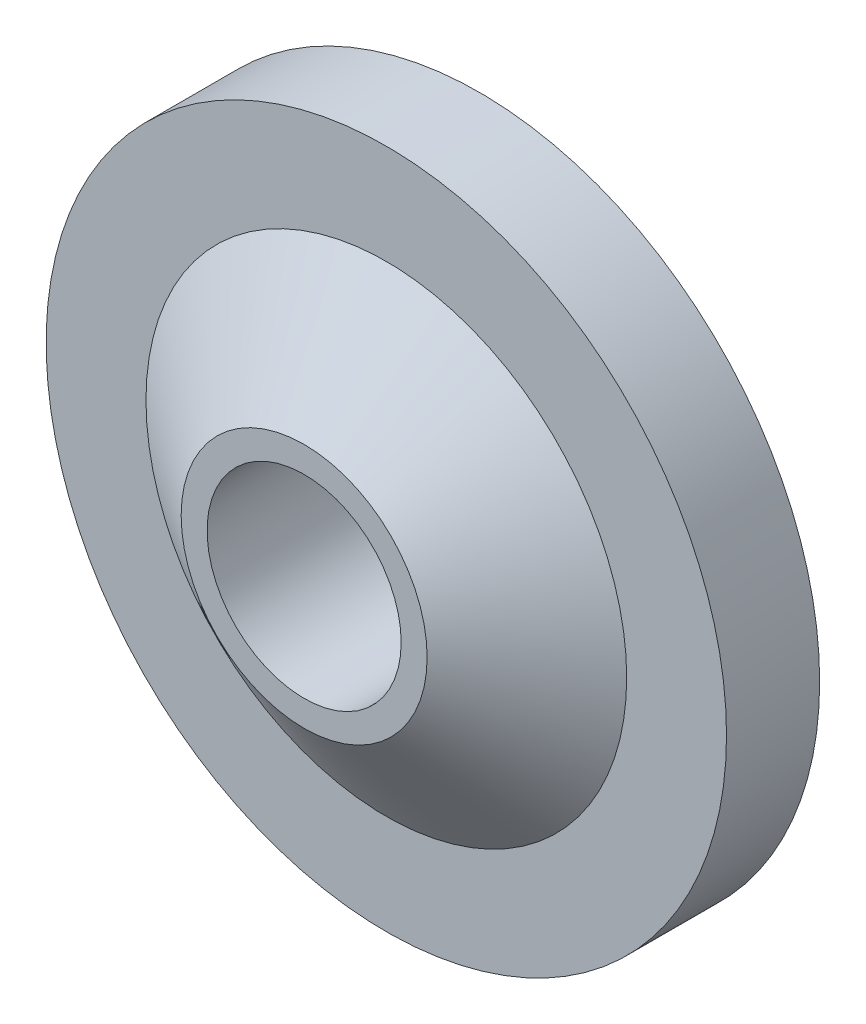
ISO-10303-21;
HEADER;
FILE_DESCRIPTION(('STEP AP214'),'2;1');
FILE_NAME('part.step','',(''),(''),'','','');
FILE_SCHEMA(('AUTOMOTIVE_DESIGN { 1 0 10303 214 1 1 1 1 }'));
ENDSEC;
DATA;
#1=APPLICATION_CONTEXT('core data for automotive mechanical design processes');
#2=APPLICATION_PROTOCOL_DEFINITION('international standard','automotive_design',2000,#1);
#3=PRODUCT_CONTEXT('',#1,'mechanical');
#4=PRODUCT('Part','Part','',(#3));
#5=PRODUCT_RELATED_PRODUCT_CATEGORY('part','',(#4));
#6=PRODUCT_DEFINITION_FORMATION('','',#4);
#7=PRODUCT_DEFINITION_CONTEXT('part definition',#1,'design');
#8=PRODUCT_DEFINITION('design','',#6,#7);
#9=PRODUCT_DEFINITION_SHAPE('','',#8);
#10=(LENGTH_UNIT() NAMED_UNIT(*) SI_UNIT(.MILLI.,.METRE.));
#11=(NAMED_UNIT(*) PLANE_ANGLE_UNIT() SI_UNIT($,.RADIAN.));
#12=(NAMED_UNIT(*) SI_UNIT($,.STERADIAN.) SOLID_ANGLE_UNIT());
#13=UNCERTAINTY_MEASURE_WITH_UNIT(LENGTH_MEASURE(1.E-05),#10,'distance_accuracy_value','');
#14=(GEOMETRIC_REPRESENTATION_CONTEXT(3) GLOBAL_UNCERTAINTY_ASSIGNED_CONTEXT((#13)) GLOBAL_UNIT_ASSIGNED_CONTEXT((#10,
#11,#12)) REPRESENTATION_CONTEXT('',''));
#15=CARTESIAN_POINT('',(0.,0.,0.));
#16=DIRECTION('',(0.,0.,1.));
#17=DIRECTION('',(1.,0.,0.));
#18=AXIS2_PLACEMENT_3D('',#15,#16,#17);
#19=CARTESIAN_POINT('',(0.,0.,17.));
#20=DIRECTION('',(0.,0.,1.));
#21=DIRECTION('',(1.,0.,0.));
#22=AXIS2_PLACEMENT_3D('',#19,#20,#21);
#23=PLANE('',#22);
#24=CARTESIAN_POINT('',(0.,0.,17.));
#25=DIRECTION('',(0.,0.,1.));
#26=DIRECTION('',(1.,0.,0.));
#27=AXIS2_PLACEMENT_3D('',#24,#25,#26);
#28=CIRCLE('',#27,62.09);
#29=CARTESIAN_POINT('',(62.09,0.,17.));
#30=VERTEX_POINT('',#29);
#31=EDGE_CURVE('E43',#30,#30,#28,.T.);
#32=ORIENTED_EDGE('',*,*,#31,.T.);
#33=EDGE_LOOP('',(#32));
#34=FACE_BOUND('',#33,.T.);
#35=CARTESIAN_POINT('',(0.,0.,17.));
#36=DIRECTION('',(0.,0.,1.));
#37=DIRECTION('',(1.,0.,0.));
#38=AXIS2_PLACEMENT_3D('',#35,#36,#37);
#39=CIRCLE('',#38,43.87);
#40=CARTESIAN_POINT('',(43.87,0.,17.));
#41=VERTEX_POINT('',#40);
#42=EDGE_CURVE('E52',#41,#41,#39,.T.);
#43=ORIENTED_EDGE('',*,*,#42,.F.);
#44=EDGE_LOOP('',(#43));
#45=FACE_BOUND('',#44,.T.);
#46=ADVANCED_FACE('F32',(#34,#45),#23,.T.);
#47=CARTESIAN_POINT('',(0.,0.,0.));
#48=DIRECTION('',(0.,0.,1.));
#49=DIRECTION('',(1.,0.,0.));
#50=AXIS2_PLACEMENT_3D('',#47,#48,#49);
#51=CONICAL_SURFACE('',#50,62.09,1.22173047639603);
#52=CARTESIAN_POINT('',(0.,0.,-10.));
#53=DIRECTION('',(0.,0.,1.));
#54=DIRECTION('',(1.,0.,0.));
#55=AXIS2_PLACEMENT_3D('',#52,#53,#54);
#56=CIRCLE('',#55,34.6152258054535);
#57=CARTESIAN_POINT('',(34.6152258054535,0.,-10.));
#58=VERTEX_POINT('',#57);
#59=EDGE_CURVE('E10',#58,#58,#56,.T.);
#60=ORIENTED_EDGE('',*,*,#59,.T.);
#61=EDGE_LOOP('',(#60));
#62=FACE_BOUND('',#61,.T.);
#63=CARTESIAN_POINT('',(0.,0.,0.));
#64=DIRECTION('',(0.,0.,1.));
#65=DIRECTION('',(1.,0.,0.));
#66=AXIS2_PLACEMENT_3D('',#63,#64,#65);
#67=CIRCLE('',#66,62.09);
#68=CARTESIAN_POINT('',(62.09,0.,0.));
#69=VERTEX_POINT('',#68);
#70=EDGE_CURVE('E39',#69,#69,#67,.T.);
#71=ORIENTED_EDGE('',*,*,#70,.F.);
#72=EDGE_LOOP('',(#71));
#73=FACE_BOUND('',#72,.T.);
#74=ADVANCED_FACE('F34',(#62,#73),#51,.T.);
#75=CARTESIAN_POINT('',(0.,0.,-10.));
#76=DIRECTION('',(0.,0.,1.));
#77=DIRECTION('',(1.,0.,0.));
#78=AXIS2_PLACEMENT_3D('',#75,#76,#77);
#79=PLANE('',#78);
#80=CARTESIAN_POINT('',(0.,0.,-10.));
#81=DIRECTION('',(0.,0.,1.));
#82=DIRECTION('',(1.,0.,0.));
#83=AXIS2_PLACEMENT_3D('',#80,#81,#82);
#84=CIRCLE('',#83,17.71);
#85=CARTESIAN_POINT('',(17.71,0.,-10.));
#86=VERTEX_POINT('',#85);
#87=EDGE_CURVE('E55',#86,#86,#84,.T.);
#88=ORIENTED_EDGE('',*,*,#87,.T.);
#89=EDGE_LOOP('',(#88));
#90=FACE_BOUND('',#89,.T.);
#91=ORIENTED_EDGE('',*,*,#59,.F.);
#92=EDGE_LOOP('',(#91));
#93=FACE_BOUND('',#92,.T.);
#94=ADVANCED_FACE('F62',(#90,#93),#79,.F.);
#95=CARTESIAN_POINT('',(0.,0.,17.));
#96=DIRECTION('',(0.,0.,-1.));
#97=DIRECTION('',(-1.,0.,0.));
#98=AXIS2_PLACEMENT_3D('',#95,#96,#97);
#99=CYLINDRICAL_SURFACE('',#98,62.09);
#100=ORIENTED_EDGE('',*,*,#31,.F.);
#101=EDGE_LOOP('',(#100));
#102=FACE_BOUND('',#101,.T.);
#103=ORIENTED_EDGE('',*,*,#70,.T.);
#104=EDGE_LOOP('',(#103));
#105=FACE_BOUND('',#104,.T.);
#106=ADVANCED_FACE('F80',(#102,#105),#99,.T.);
#107=CARTESIAN_POINT('',(0.,0.,17.));
#108=DIRECTION('',(0.,0.,-1.));
#109=DIRECTION('',(1.,0.,0.));
#110=AXIS2_PLACEMENT_3D('',#107,#108,#109);
#111=CONICAL_SURFACE('',#110,43.87,0.959931088596883);
#112=CARTESIAN_POINT('',(0.,0.,32.));
#113=DIRECTION('',(0.,0.,1.));
#114=DIRECTION('',(1.,0.,0.));
#115=AXIS2_PLACEMENT_3D('',#112,#113,#114);
#116=CIRCLE('',#115,22.4477798988682);
#117=CARTESIAN_POINT('',(22.4477798988682,0.,32.));
#118=VERTEX_POINT('',#117);
#119=EDGE_CURVE('E47',#118,#118,#116,.T.);
#120=ORIENTED_EDGE('',*,*,#119,.F.);
#121=EDGE_LOOP('',(#120));
#122=FACE_BOUND('',#121,.T.);
#123=ORIENTED_EDGE('',*,*,#42,.T.);
#124=EDGE_LOOP('',(#123));
#125=FACE_BOUND('',#124,.T.);
#126=ADVANCED_FACE('F74',(#122,#125),#111,.T.);
#127=CARTESIAN_POINT('',(0.,0.,32.));
#128=DIRECTION('',(0.,0.,1.));
#129=DIRECTION('',(1.,0.,0.));
#130=AXIS2_PLACEMENT_3D('',#127,#128,#129);
#131=PLANE('',#130);
#132=CARTESIAN_POINT('',(0.,0.,32.));
#133=DIRECTION('',(0.,0.,1.));
#134=DIRECTION('',(1.,0.,0.));
#135=AXIS2_PLACEMENT_3D('',#132,#133,#134);
#136=CIRCLE('',#135,17.71);
#137=CARTESIAN_POINT('',(17.71,0.,32.));
#138=VERTEX_POINT('',#137);
#139=EDGE_CURVE('E56',#138,#138,#136,.T.);
#140=ORIENTED_EDGE('',*,*,#139,.F.);
#141=EDGE_LOOP('',(#140));
#142=FACE_BOUND('',#141,.T.);
#143=ORIENTED_EDGE('',*,*,#119,.T.);
#144=EDGE_LOOP('',(#143));
#145=FACE_BOUND('',#144,.T.);
#146=ADVANCED_FACE('F68',(#142,#145),#131,.T.);
#147=CARTESIAN_POINT('',(0.,0.,-10.));
#148=DIRECTION('',(0.,0.,1.));
#149=DIRECTION('',(1.,0.,0.));
#150=AXIS2_PLACEMENT_3D('',#147,#148,#149);
#151=CYLINDRICAL_SURFACE('',#150,17.71);
#152=CARTESIAN_POINT('',(17.71,0.,-10.));
#153=CARTESIAN_POINT('',(17.71,0.,-9.5625));
#154=CARTESIAN_POINT('',(17.71,0.,-9.125));
#155=CARTESIAN_POINT('',(17.71,0.,-8.25));
#156=CARTESIAN_POINT('',(17.71,0.,-7.8125));
#157=CARTESIAN_POINT('',(17.71,0.,-6.9375));
#158=CARTESIAN_POINT('',(17.71,0.,-6.5));
#159=CARTESIAN_POINT('',(17.71,0.,-5.625));
#160=CARTESIAN_POINT('',(17.71,0.,-5.1875));
#161=CARTESIAN_POINT('',(17.71,0.,-4.3125));
#162=CARTESIAN_POINT('',(17.71,0.,-3.875));
#163=CARTESIAN_POINT('',(17.71,0.,-3.));
#164=CARTESIAN_POINT('',(17.71,0.,-2.5625));
#165=CARTESIAN_POINT('',(17.71,0.,-1.6875));
#166=CARTESIAN_POINT('',(17.71,0.,-1.25));
#167=CARTESIAN_POINT('',(17.71,0.,-0.375000000000002));
#168=CARTESIAN_POINT('',(17.71,0.,0.0624999999999983));
#169=CARTESIAN_POINT('',(17.71,0.,0.937499999999999));
#170=CARTESIAN_POINT('',(17.71,0.,1.375));
#171=CARTESIAN_POINT('',(17.71,0.,2.25));
#172=CARTESIAN_POINT('',(17.71,0.,2.6875));
#173=CARTESIAN_POINT('',(17.71,0.,3.5625));
#174=CARTESIAN_POINT('',(17.71,0.,4.));
#175=CARTESIAN_POINT('',(17.71,0.,4.875));
#176=CARTESIAN_POINT('',(17.71,0.,5.3125));
#177=CARTESIAN_POINT('',(17.71,0.,6.1875));
#178=CARTESIAN_POINT('',(17.71,0.,6.625));
#179=CARTESIAN_POINT('',(17.71,0.,7.5));
#180=CARTESIAN_POINT('',(17.71,0.,7.9375));
#181=CARTESIAN_POINT('',(17.71,0.,8.8125));
#182=CARTESIAN_POINT('',(17.71,0.,9.25));
#183=CARTESIAN_POINT('',(17.71,0.,10.125));
#184=CARTESIAN_POINT('',(17.71,0.,10.5625));
#185=CARTESIAN_POINT('',(17.71,0.,11.4375));
#186=CARTESIAN_POINT('',(17.71,0.,11.875));
#187=CARTESIAN_POINT('',(17.71,0.,12.75));
#188=CARTESIAN_POINT('',(17.71,0.,13.1875));
#189=CARTESIAN_POINT('',(17.71,0.,14.0625));
#190=CARTESIAN_POINT('',(17.71,0.,14.5));
#191=CARTESIAN_POINT('',(17.71,0.,15.375));
#192=CARTESIAN_POINT('',(17.71,0.,15.8125));
#193=CARTESIAN_POINT('',(17.71,0.,16.6875));
#194=CARTESIAN_POINT('',(17.71,0.,17.125));
#195=CARTESIAN_POINT('',(17.71,0.,18.));
#196=CARTESIAN_POINT('',(17.71,0.,18.4375));
#197=CARTESIAN_POINT('',(17.71,0.,19.3125));
#198=CARTESIAN_POINT('',(17.71,0.,19.75));
#199=CARTESIAN_POINT('',(17.71,0.,20.625));
#200=CARTESIAN_POINT('',(17.71,0.,21.0625));
#201=CARTESIAN_POINT('',(17.71,0.,21.9375));
#202=CARTESIAN_POINT('',(17.71,0.,22.375));
#203=CARTESIAN_POINT('',(17.71,0.,23.25));
#204=CARTESIAN_POINT('',(17.71,0.,23.6875));
#205=CARTESIAN_POINT('',(17.71,0.,24.5625));
#206=CARTESIAN_POINT('',(17.71,0.,25.));
#207=CARTESIAN_POINT('',(17.71,0.,25.875));
#208=CARTESIAN_POINT('',(17.71,0.,26.3125));
#209=CARTESIAN_POINT('',(17.71,0.,27.1875));
#210=CARTESIAN_POINT('',(17.71,0.,27.625));
#211=CARTESIAN_POINT('',(17.71,0.,28.5));
#212=CARTESIAN_POINT('',(17.71,0.,28.9375));
#213=CARTESIAN_POINT('',(17.71,0.,29.8125));
#214=CARTESIAN_POINT('',(17.71,0.,30.25));
#215=CARTESIAN_POINT('',(17.71,0.,31.125));
#216=CARTESIAN_POINT('',(17.71,0.,31.5625));
#217=CARTESIAN_POINT('',(17.71,0.,32.));
#218=B_SPLINE_CURVE_WITH_KNOTS('',3,(#152,#153,#154,#155,#156,#157,#158,#159,#160,#161,#162,
#163,#164,#165,#166,#167,#168,#169,#170,#171,#172,#173,#174,#175,#176,#177,#178,#179,#180,#181,
#182,#183,#184,#185,#186,#187,#188,#189,#190,#191,#192,#193,#194,#195,#196,#197,#198,#199,#200,
#201,#202,#203,#204,#205,#206,#207,#208,#209,#210,#211,#212,#213,#214,#215,#216,#217),
.UNSPECIFIED.,.F.,.F.,(4,2,2,2,2,2,2,2,2,2,2,2,2,2,2,2,2,2,2,2,2,2,2,2,2,2,2,2,2,2,2,2,4),(0.,
1.3125,2.625,3.9375,5.25,6.5625,7.875,9.1875,10.5,11.8125,13.125,14.4375,15.75,17.0625,18.375,
19.6875,21.,22.3125,23.625,24.9375,26.25,27.5625,28.875,30.1875,31.5,32.8125,34.125,35.4375,
36.75,38.0625,39.375,40.6875,42.),.UNSPECIFIED.);
#219=EDGE_CURVE('BSEAM65',#86,#138,#218,.T.);
#220=ORIENTED_EDGE('',*,*,#87,.F.);
#221=ORIENTED_EDGE('',*,*,#139,.T.);
#222=ORIENTED_EDGE('',*,*,#219,.T.);
#223=ORIENTED_EDGE('',*,*,#219,.F.);
#224=EDGE_LOOP('',(#220,#222,#221,#223));
#225=FACE_BOUND('',#224,.T.);
#226=ADVANCED_FACE('F65',(#225),#151,.F.);
#227=CLOSED_SHELL('',(#46,#74,#94,#106,#126,#146,#226));
#228=MANIFOLD_SOLID_BREP('B2',#227);
#229=ADVANCED_BREP_SHAPE_REPRESENTATION('',(#18,#228),#14);
#230=SHAPE_DEFINITION_REPRESENTATION(#9,#229);
ENDSEC;
END-ISO-10303-21;
